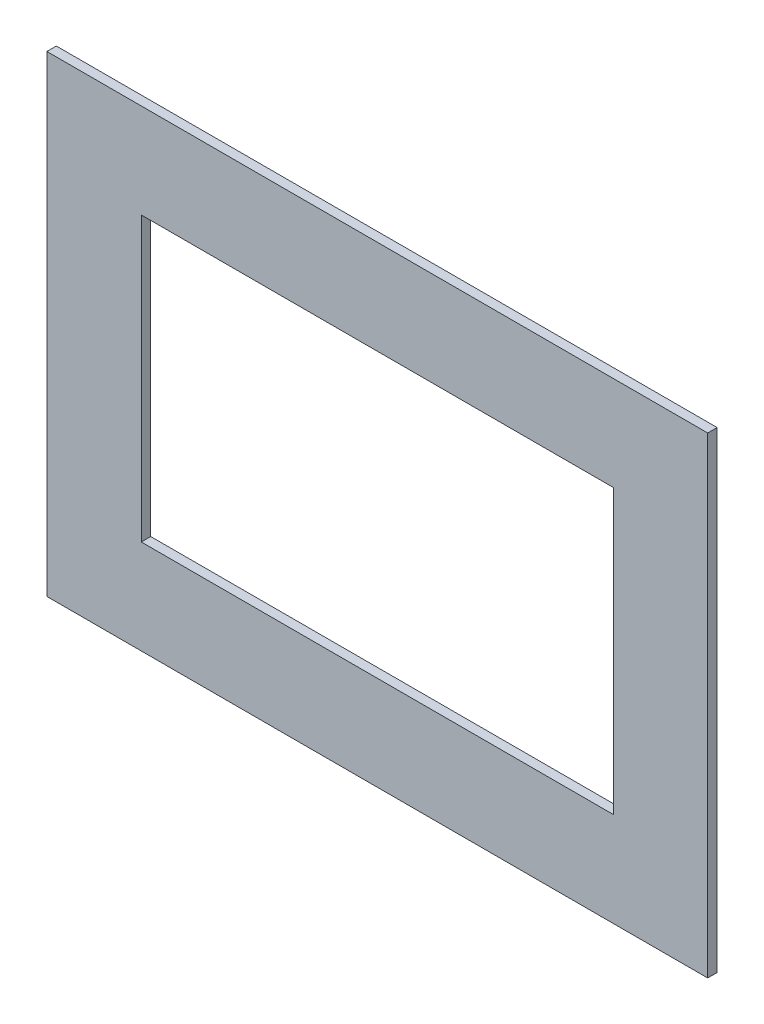
ISO-10303-21;
HEADER;
FILE_DESCRIPTION(('STEP AP214'),'2;1');
FILE_NAME('part.step','',(''),(''),'','','');
FILE_SCHEMA(('AUTOMOTIVE_DESIGN { 1 0 10303 214 1 1 1 1 }'));
ENDSEC;
DATA;
#1=APPLICATION_CONTEXT('core data for automotive mechanical design processes');
#2=APPLICATION_PROTOCOL_DEFINITION('international standard','automotive_design',2000,#1);
#3=PRODUCT_CONTEXT('',#1,'mechanical');
#4=PRODUCT('Part','Part','',(#3));
#5=PRODUCT_RELATED_PRODUCT_CATEGORY('part','',(#4));
#6=PRODUCT_DEFINITION_FORMATION('','',#4);
#7=PRODUCT_DEFINITION_CONTEXT('part definition',#1,'design');
#8=PRODUCT_DEFINITION('design','',#6,#7);
#9=PRODUCT_DEFINITION_SHAPE('','',#8);
#10=(LENGTH_UNIT() NAMED_UNIT(*) SI_UNIT(.MILLI.,.METRE.));
#11=(NAMED_UNIT(*) PLANE_ANGLE_UNIT() SI_UNIT($,.RADIAN.));
#12=(NAMED_UNIT(*) SI_UNIT($,.STERADIAN.) SOLID_ANGLE_UNIT());
#13=UNCERTAINTY_MEASURE_WITH_UNIT(LENGTH_MEASURE(1.E-05),#10,'distance_accuracy_value','');
#14=(GEOMETRIC_REPRESENTATION_CONTEXT(3) GLOBAL_UNCERTAINTY_ASSIGNED_CONTEXT((#13)) GLOBAL_UNIT_ASSIGNED_CONTEXT((#10,
#11,#12)) REPRESENTATION_CONTEXT('',''));
#15=CARTESIAN_POINT('',(0.,0.,0.));
#16=DIRECTION('',(0.,0.,1.));
#17=DIRECTION('',(1.,0.,0.));
#18=AXIS2_PLACEMENT_3D('',#15,#16,#17);
#19=CARTESIAN_POINT('',(0.,0.,10.));
#20=DIRECTION('',(-1.,0.,0.));
#21=DIRECTION('',(0.,-1.,0.));
#22=AXIS2_PLACEMENT_3D('',#19,#20,#21);
#23=PLANE('',#22);
#24=DIRECTION('',(0.,1.,0.));
#25=VECTOR('',#24,1.);
#26=CARTESIAN_POINT('',(0.,0.,0.));
#27=LINE('',#26,#25);
#28=CARTESIAN_POINT('',(0.,0.,0.));
#29=VERTEX_POINT('',#28);
#30=CARTESIAN_POINT('',(0.,500.,0.));
#31=VERTEX_POINT('',#30);
#32=EDGE_CURVE('E130',#29,#31,#27,.T.);
#33=ORIENTED_EDGE('',*,*,#32,.T.);
#34=DIRECTION('',(0.,0.,-1.));
#35=VECTOR('',#34,1.);
#36=CARTESIAN_POINT('',(0.,500.,10.));
#37=LINE('',#36,#35);
#38=CARTESIAN_POINT('',(0.,500.,10.));
#39=VERTEX_POINT('',#38);
#40=EDGE_CURVE('E11',#39,#31,#37,.T.);
#41=ORIENTED_EDGE('',*,*,#40,.F.);
#42=DIRECTION('',(0.,1.,0.));
#43=VECTOR('',#42,1.);
#44=CARTESIAN_POINT('',(0.,0.,10.));
#45=LINE('',#44,#43);
#46=CARTESIAN_POINT('',(0.,0.,10.));
#47=VERTEX_POINT('',#46);
#48=EDGE_CURVE('E134',#47,#39,#45,.T.);
#49=ORIENTED_EDGE('',*,*,#48,.F.);
#50=DIRECTION('',(0.,0.,-1.));
#51=VECTOR('',#50,1.);
#52=CARTESIAN_POINT('',(0.,0.,10.));
#53=LINE('',#52,#51);
#54=EDGE_CURVE('E144',#47,#29,#53,.T.);
#55=ORIENTED_EDGE('',*,*,#54,.T.);
#56=EDGE_LOOP('',(#33,#41,#49,#55));
#57=FACE_BOUND('',#56,.T.);
#58=ADVANCED_FACE('F33',(#57),#23,.F.);
#59=CARTESIAN_POINT('',(0.,500.,10.));
#60=DIRECTION('',(0.,-1.,0.));
#61=DIRECTION('',(0.,0.,-1.));
#62=AXIS2_PLACEMENT_3D('',#59,#60,#61);
#63=PLANE('',#62);
#64=DIRECTION('',(-1.,0.,0.));
#65=VECTOR('',#64,1.);
#66=CARTESIAN_POINT('',(0.,500.,0.));
#67=LINE('',#66,#65);
#68=CARTESIAN_POINT('',(-700.,500.,0.));
#69=VERTEX_POINT('',#68);
#70=EDGE_CURVE('E147',#31,#69,#67,.T.);
#71=ORIENTED_EDGE('',*,*,#70,.T.);
#72=DIRECTION('',(0.,0.,-1.));
#73=VECTOR('',#72,1.);
#74=CARTESIAN_POINT('',(-700.,500.,10.));
#75=LINE('',#74,#73);
#76=CARTESIAN_POINT('',(-700.,500.,10.));
#77=VERTEX_POINT('',#76);
#78=EDGE_CURVE('E40',#77,#69,#75,.T.);
#79=ORIENTED_EDGE('',*,*,#78,.F.);
#80=DIRECTION('',(-1.,0.,0.));
#81=VECTOR('',#80,1.);
#82=CARTESIAN_POINT('',(0.,500.,10.));
#83=LINE('',#82,#81);
#84=EDGE_CURVE('E137',#39,#77,#83,.T.);
#85=ORIENTED_EDGE('',*,*,#84,.F.);
#86=ORIENTED_EDGE('',*,*,#40,.T.);
#87=EDGE_LOOP('',(#71,#79,#85,#86));
#88=FACE_BOUND('',#87,.T.);
#89=ADVANCED_FACE('F175',(#88),#63,.F.);
#90=CARTESIAN_POINT('',(-700.,0.,10.));
#91=DIRECTION('',(1.,0.,0.));
#92=DIRECTION('',(0.,1.,0.));
#93=AXIS2_PLACEMENT_3D('',#90,#91,#92);
#94=PLANE('',#93);
#95=DIRECTION('',(0.,-1.,0.));
#96=VECTOR('',#95,1.);
#97=CARTESIAN_POINT('',(-700.,0.,0.));
#98=LINE('',#97,#96);
#99=CARTESIAN_POINT('',(-700.,0.,0.));
#100=VERTEX_POINT('',#99);
#101=EDGE_CURVE('E149',#69,#100,#98,.T.);
#102=ORIENTED_EDGE('',*,*,#101,.T.);
#103=DIRECTION('',(0.,0.,-1.));
#104=VECTOR('',#103,1.);
#105=CARTESIAN_POINT('',(-700.,0.,10.));
#106=LINE('',#105,#104);
#107=CARTESIAN_POINT('',(-700.,0.,10.));
#108=VERTEX_POINT('',#107);
#109=EDGE_CURVE('E154',#108,#100,#106,.T.);
#110=ORIENTED_EDGE('',*,*,#109,.F.);
#111=DIRECTION('',(0.,-1.,0.));
#112=VECTOR('',#111,1.);
#113=CARTESIAN_POINT('',(-700.,0.,10.));
#114=LINE('',#113,#112);
#115=EDGE_CURVE('E140',#77,#108,#114,.T.);
#116=ORIENTED_EDGE('',*,*,#115,.F.);
#117=ORIENTED_EDGE('',*,*,#78,.T.);
#118=EDGE_LOOP('',(#102,#110,#116,#117));
#119=FACE_BOUND('',#118,.T.);
#120=ADVANCED_FACE('F161',(#119),#94,.F.);
#121=CARTESIAN_POINT('',(0.,0.,10.));
#122=DIRECTION('',(0.,1.,0.));
#123=DIRECTION('',(-1.,0.,0.));
#124=AXIS2_PLACEMENT_3D('',#121,#122,#123);
#125=PLANE('',#124);
#126=DIRECTION('',(1.,0.,0.));
#127=VECTOR('',#126,1.);
#128=CARTESIAN_POINT('',(0.,0.,0.));
#129=LINE('',#128,#127);
#130=EDGE_CURVE('E138',#100,#29,#129,.T.);
#131=ORIENTED_EDGE('',*,*,#130,.T.);
#132=ORIENTED_EDGE('',*,*,#54,.F.);
#133=DIRECTION('',(1.,0.,0.));
#134=VECTOR('',#133,1.);
#135=CARTESIAN_POINT('',(0.,0.,10.));
#136=LINE('',#135,#134);
#137=EDGE_CURVE('E142',#108,#47,#136,.T.);
#138=ORIENTED_EDGE('',*,*,#137,.F.);
#139=ORIENTED_EDGE('',*,*,#109,.T.);
#140=EDGE_LOOP('',(#131,#132,#138,#139));
#141=FACE_BOUND('',#140,.T.);
#142=ADVANCED_FACE('F170',(#141),#125,.F.);
#143=CARTESIAN_POINT('',(0.,0.,10.));
#144=DIRECTION('',(0.,0.,1.));
#145=DIRECTION('',(1.,0.,0.));
#146=AXIS2_PLACEMENT_3D('',#143,#144,#145);
#147=PLANE('',#146);
#148=DIRECTION('',(0.,-1.,0.));
#149=VECTOR('',#148,1.);
#150=CARTESIAN_POINT('',(-100.,400.,10.));
#151=LINE('',#150,#149);
#152=CARTESIAN_POINT('',(-100.,400.,10.));
#153=VERTEX_POINT('',#152);
#154=CARTESIAN_POINT('',(-100.,100.,10.));
#155=VERTEX_POINT('',#154);
#156=EDGE_CURVE('E99',#153,#155,#151,.T.);
#157=ORIENTED_EDGE('',*,*,#156,.T.);
#158=DIRECTION('',(-1.,0.,0.));
#159=VECTOR('',#158,1.);
#160=CARTESIAN_POINT('',(-100.,100.,10.));
#161=LINE('',#160,#159);
#162=CARTESIAN_POINT('',(-600.,100.,10.));
#163=VERTEX_POINT('',#162);
#164=EDGE_CURVE('E108',#155,#163,#161,.T.);
#165=ORIENTED_EDGE('',*,*,#164,.T.);
#166=DIRECTION('',(0.,1.,0.));
#167=VECTOR('',#166,1.);
#168=CARTESIAN_POINT('',(-600.,400.,10.));
#169=LINE('',#168,#167);
#170=CARTESIAN_POINT('',(-600.,400.,10.));
#171=VERTEX_POINT('',#170);
#172=EDGE_CURVE('E47',#163,#171,#169,.T.);
#173=ORIENTED_EDGE('',*,*,#172,.T.);
#174=DIRECTION('',(1.,0.,0.));
#175=VECTOR('',#174,1.);
#176=CARTESIAN_POINT('',(-100.,400.,10.));
#177=LINE('',#176,#175);
#178=EDGE_CURVE('E105',#171,#153,#177,.T.);
#179=ORIENTED_EDGE('',*,*,#178,.T.);
#180=EDGE_LOOP('',(#157,#165,#173,#179));
#181=FACE_BOUND('',#180,.T.);
#182=ORIENTED_EDGE('',*,*,#48,.T.);
#183=ORIENTED_EDGE('',*,*,#84,.T.);
#184=ORIENTED_EDGE('',*,*,#115,.T.);
#185=ORIENTED_EDGE('',*,*,#137,.T.);
#186=EDGE_LOOP('',(#182,#183,#184,#185));
#187=FACE_BOUND('',#186,.T.);
#188=ADVANCED_FACE('F112',(#181,#187),#147,.T.);
#189=CARTESIAN_POINT('',(0.,0.,0.));
#190=DIRECTION('',(0.,0.,1.));
#191=DIRECTION('',(1.,0.,0.));
#192=AXIS2_PLACEMENT_3D('',#189,#190,#191);
#193=PLANE('',#192);
#194=DIRECTION('',(-1.,0.,0.));
#195=VECTOR('',#194,1.);
#196=CARTESIAN_POINT('',(-100.,100.,0.));
#197=LINE('',#196,#195);
#198=CARTESIAN_POINT('',(-100.,100.,0.));
#199=VERTEX_POINT('',#198);
#200=CARTESIAN_POINT('',(-600.,100.,0.));
#201=VERTEX_POINT('',#200);
#202=EDGE_CURVE('E124',#199,#201,#197,.T.);
#203=ORIENTED_EDGE('',*,*,#202,.F.);
#204=DIRECTION('',(0.,-1.,0.));
#205=VECTOR('',#204,1.);
#206=CARTESIAN_POINT('',(-100.,400.,0.));
#207=LINE('',#206,#205);
#208=CARTESIAN_POINT('',(-100.,400.,0.));
#209=VERTEX_POINT('',#208);
#210=EDGE_CURVE('E55',#209,#199,#207,.T.);
#211=ORIENTED_EDGE('',*,*,#210,.F.);
#212=DIRECTION('',(1.,0.,0.));
#213=VECTOR('',#212,1.);
#214=CARTESIAN_POINT('',(-100.,400.,0.));
#215=LINE('',#214,#213);
#216=CARTESIAN_POINT('',(-600.,400.,0.));
#217=VERTEX_POINT('',#216);
#218=EDGE_CURVE('E115',#217,#209,#215,.T.);
#219=ORIENTED_EDGE('',*,*,#218,.F.);
#220=DIRECTION('',(0.,1.,0.));
#221=VECTOR('',#220,1.);
#222=CARTESIAN_POINT('',(-600.,400.,0.));
#223=LINE('',#222,#221);
#224=EDGE_CURVE('E118',#201,#217,#223,.T.);
#225=ORIENTED_EDGE('',*,*,#224,.F.);
#226=EDGE_LOOP('',(#203,#211,#219,#225));
#227=FACE_BOUND('',#226,.T.);
#228=ORIENTED_EDGE('',*,*,#32,.F.);
#229=ORIENTED_EDGE('',*,*,#130,.F.);
#230=ORIENTED_EDGE('',*,*,#101,.F.);
#231=ORIENTED_EDGE('',*,*,#70,.F.);
#232=EDGE_LOOP('',(#228,#229,#230,#231));
#233=FACE_BOUND('',#232,.T.);
#234=ADVANCED_FACE('F167',(#227,#233),#193,.F.);
#235=CARTESIAN_POINT('',(-100.,400.,10.));
#236=DIRECTION('',(1.,0.,0.));
#237=DIRECTION('',(0.,1.,0.));
#238=AXIS2_PLACEMENT_3D('',#235,#236,#237);
#239=PLANE('',#238);
#240=ORIENTED_EDGE('',*,*,#210,.T.);
#241=DIRECTION('',(0.,0.,-1.));
#242=VECTOR('',#241,1.);
#243=CARTESIAN_POINT('',(-100.,100.,10.));
#244=LINE('',#243,#242);
#245=EDGE_CURVE('E95',#155,#199,#244,.T.);
#246=ORIENTED_EDGE('',*,*,#245,.F.);
#247=ORIENTED_EDGE('',*,*,#156,.F.);
#248=DIRECTION('',(0.,0.,-1.));
#249=VECTOR('',#248,1.);
#250=CARTESIAN_POINT('',(-100.,400.,10.));
#251=LINE('',#250,#249);
#252=EDGE_CURVE('E128',#153,#209,#251,.T.);
#253=ORIENTED_EDGE('',*,*,#252,.T.);
#254=EDGE_LOOP('',(#240,#246,#247,#253));
#255=FACE_BOUND('',#254,.T.);
#256=ADVANCED_FACE('F97',(#255),#239,.F.);
#257=CARTESIAN_POINT('',(-100.,400.,10.));
#258=DIRECTION('',(0.,1.,0.));
#259=DIRECTION('',(0.,0.,1.));
#260=AXIS2_PLACEMENT_3D('',#257,#258,#259);
#261=PLANE('',#260);
#262=ORIENTED_EDGE('',*,*,#218,.T.);
#263=ORIENTED_EDGE('',*,*,#252,.F.);
#264=ORIENTED_EDGE('',*,*,#178,.F.);
#265=DIRECTION('',(0.,0.,-1.));
#266=VECTOR('',#265,1.);
#267=CARTESIAN_POINT('',(-600.,400.,10.));
#268=LINE('',#267,#266);
#269=EDGE_CURVE('E131',#171,#217,#268,.T.);
#270=ORIENTED_EDGE('',*,*,#269,.T.);
#271=EDGE_LOOP('',(#262,#263,#264,#270));
#272=FACE_BOUND('',#271,.T.);
#273=ADVANCED_FACE('F192',(#272),#261,.F.);
#274=CARTESIAN_POINT('',(-600.,400.,10.));
#275=DIRECTION('',(-1.,0.,0.));
#276=DIRECTION('',(0.,0.,1.));
#277=AXIS2_PLACEMENT_3D('',#274,#275,#276);
#278=PLANE('',#277);
#279=ORIENTED_EDGE('',*,*,#224,.T.);
#280=ORIENTED_EDGE('',*,*,#269,.F.);
#281=ORIENTED_EDGE('',*,*,#172,.F.);
#282=DIRECTION('',(0.,0.,-1.));
#283=VECTOR('',#282,1.);
#284=CARTESIAN_POINT('',(-600.,100.,10.));
#285=LINE('',#284,#283);
#286=EDGE_CURVE('E104',#163,#201,#285,.T.);
#287=ORIENTED_EDGE('',*,*,#286,.T.);
#288=EDGE_LOOP('',(#279,#280,#281,#287));
#289=FACE_BOUND('',#288,.T.);
#290=ADVANCED_FACE('F195',(#289),#278,.F.);
#291=CARTESIAN_POINT('',(-100.,100.,10.));
#292=DIRECTION('',(0.,-1.,0.));
#293=DIRECTION('',(0.,0.,-1.));
#294=AXIS2_PLACEMENT_3D('',#291,#292,#293);
#295=PLANE('',#294);
#296=ORIENTED_EDGE('',*,*,#202,.T.);
#297=ORIENTED_EDGE('',*,*,#286,.F.);
#298=ORIENTED_EDGE('',*,*,#164,.F.);
#299=ORIENTED_EDGE('',*,*,#245,.T.);
#300=EDGE_LOOP('',(#296,#297,#298,#299));
#301=FACE_BOUND('',#300,.T.);
#302=ADVANCED_FACE('F109',(#301),#295,.F.);
#303=CLOSED_SHELL('',(#58,#89,#120,#142,#188,#234,#256,#273,#290,#302));
#304=MANIFOLD_SOLID_BREP('B2',#303);
#305=ADVANCED_BREP_SHAPE_REPRESENTATION('',(#18,#304),#14);
#306=SHAPE_DEFINITION_REPRESENTATION(#9,#305);
ENDSEC;
END-ISO-10303-21;
